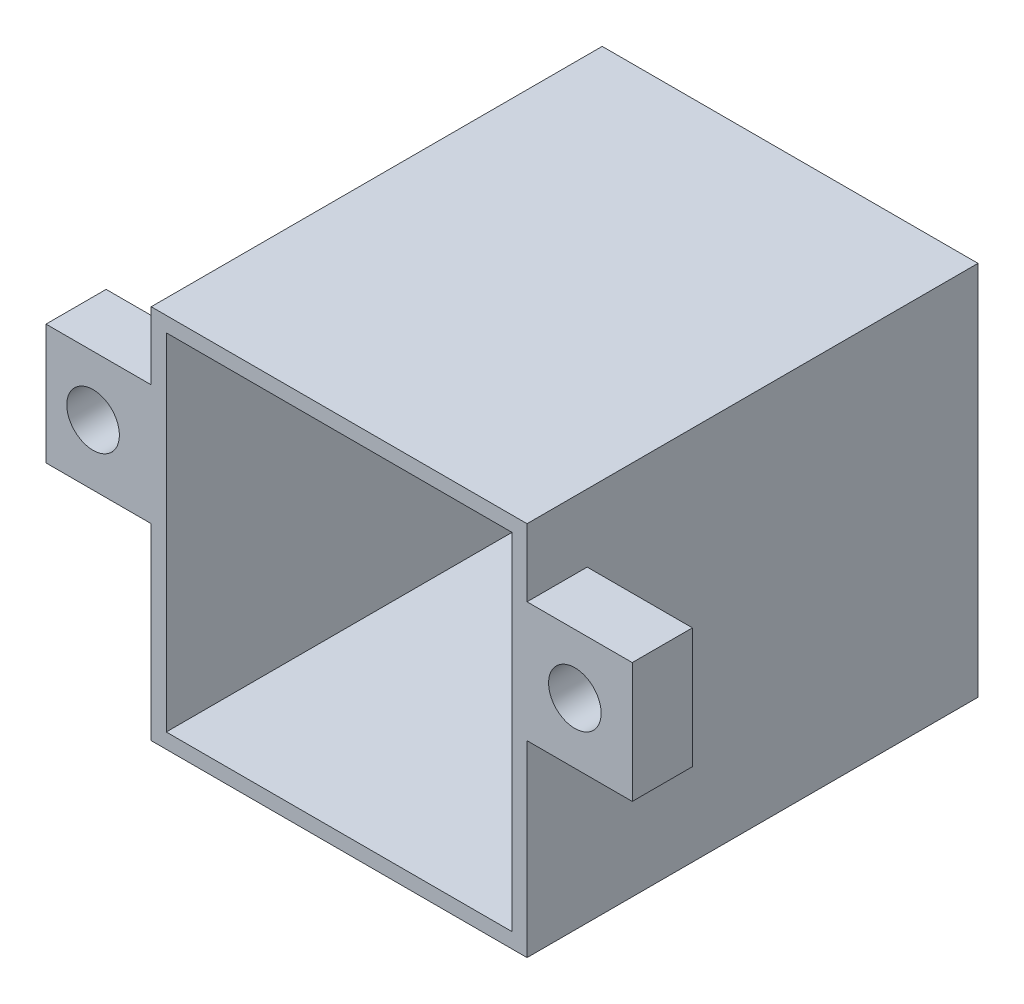
ISO-10303-21;
HEADER;
FILE_DESCRIPTION(('STEP AP214'),'2;1');
FILE_NAME('part.step','',(''),(''),'','','');
FILE_SCHEMA(('AUTOMOTIVE_DESIGN { 1 0 10303 214 1 1 1 1 }'));
ENDSEC;
DATA;
#1=APPLICATION_CONTEXT('core data for automotive mechanical design processes');
#2=APPLICATION_PROTOCOL_DEFINITION('international standard','automotive_design',2000,#1);
#3=PRODUCT_CONTEXT('',#1,'mechanical');
#4=PRODUCT('Part','Part','',(#3));
#5=PRODUCT_RELATED_PRODUCT_CATEGORY('part','',(#4));
#6=PRODUCT_DEFINITION_FORMATION('','',#4);
#7=PRODUCT_DEFINITION_CONTEXT('part definition',#1,'design');
#8=PRODUCT_DEFINITION('design','',#6,#7);
#9=PRODUCT_DEFINITION_SHAPE('','',#8);
#10=(LENGTH_UNIT() NAMED_UNIT(*) SI_UNIT(.MILLI.,.METRE.));
#11=(NAMED_UNIT(*) PLANE_ANGLE_UNIT() SI_UNIT($,.RADIAN.));
#12=(NAMED_UNIT(*) SI_UNIT($,.STERADIAN.) SOLID_ANGLE_UNIT());
#13=UNCERTAINTY_MEASURE_WITH_UNIT(LENGTH_MEASURE(1.E-05),#10,'distance_accuracy_value','');
#14=(GEOMETRIC_REPRESENTATION_CONTEXT(3) GLOBAL_UNCERTAINTY_ASSIGNED_CONTEXT((#13)) GLOBAL_UNIT_ASSIGNED_CONTEXT((#10,
#11,#12)) REPRESENTATION_CONTEXT('',''));
#15=CARTESIAN_POINT('',(0.,0.,0.));
#16=DIRECTION('',(0.,0.,1.));
#17=DIRECTION('',(1.,0.,0.));
#18=AXIS2_PLACEMENT_3D('',#15,#16,#17);
#19=CARTESIAN_POINT('',(-12.5,-12.5,30.));
#20=DIRECTION('',(1.,0.,0.));
#21=DIRECTION('',(0.,0.,-1.));
#22=AXIS2_PLACEMENT_3D('',#19,#20,#21);
#23=PLANE('',#22);
#24=DIRECTION('',(0.,0.,1.));
#25=VECTOR('',#24,1.);
#26=CARTESIAN_POINT('',(-12.5,0.,26.));
#27=LINE('',#26,#25);
#28=CARTESIAN_POINT('',(-12.5,0.,26.));
#29=VERTEX_POINT('',#28);
#30=CARTESIAN_POINT('',(-12.5,0.,30.));
#31=VERTEX_POINT('',#30);
#32=EDGE_CURVE('E177',#29,#31,#27,.T.);
#33=ORIENTED_EDGE('',*,*,#32,.F.);
#34=DIRECTION('',(0.,1.,0.));
#35=VECTOR('',#34,1.);
#36=CARTESIAN_POINT('',(-12.5,0.,26.));
#37=LINE('',#36,#35);
#38=CARTESIAN_POINT('',(-12.5,8.,26.));
#39=VERTEX_POINT('',#38);
#40=EDGE_CURVE('E169',#29,#39,#37,.T.);
#41=ORIENTED_EDGE('',*,*,#40,.T.);
#42=DIRECTION('',(0.,0.,1.));
#43=VECTOR('',#42,1.);
#44=CARTESIAN_POINT('',(-12.5,8.,26.));
#45=LINE('',#44,#43);
#46=CARTESIAN_POINT('',(-12.5,8.,30.));
#47=VERTEX_POINT('',#46);
#48=EDGE_CURVE('E153',#39,#47,#45,.T.);
#49=ORIENTED_EDGE('',*,*,#48,.T.);
#50=DIRECTION('',(0.,-1.,0.));
#51=VECTOR('',#50,1.);
#52=CARTESIAN_POINT('',(-12.5,-12.5,30.));
#53=LINE('',#52,#51);
#54=CARTESIAN_POINT('',(-12.5,12.5,30.));
#55=VERTEX_POINT('',#54);
#56=EDGE_CURVE('E300',#55,#47,#53,.T.);
#57=ORIENTED_EDGE('',*,*,#56,.F.);
#58=DIRECTION('',(0.,0.,-1.));
#59=VECTOR('',#58,1.);
#60=CARTESIAN_POINT('',(-12.5,12.5,30.));
#61=LINE('',#60,#59);
#62=CARTESIAN_POINT('',(-12.5,12.5,0.));
#63=VERTEX_POINT('',#62);
#64=EDGE_CURVE('E49',#55,#63,#61,.T.);
#65=ORIENTED_EDGE('',*,*,#64,.T.);
#66=DIRECTION('',(0.,-1.,0.));
#67=VECTOR('',#66,1.);
#68=CARTESIAN_POINT('',(-12.5,-12.5,0.));
#69=LINE('',#68,#67);
#70=CARTESIAN_POINT('',(-12.5,-12.5,0.));
#71=VERTEX_POINT('',#70);
#72=EDGE_CURVE('E313',#63,#71,#69,.T.);
#73=ORIENTED_EDGE('',*,*,#72,.T.);
#74=DIRECTION('',(0.,0.,-1.));
#75=VECTOR('',#74,1.);
#76=CARTESIAN_POINT('',(-12.5,-12.5,30.));
#77=LINE('',#76,#75);
#78=CARTESIAN_POINT('',(-12.5,-12.5,30.));
#79=VERTEX_POINT('',#78);
#80=EDGE_CURVE('E322',#79,#71,#77,.T.);
#81=ORIENTED_EDGE('',*,*,#80,.F.);
#82=EDGE_CURVE('E299',#31,#79,#53,.T.);
#83=ORIENTED_EDGE('',*,*,#82,.F.);
#84=EDGE_LOOP('',(#33,#41,#49,#57,#65,#73,#81,#83));
#85=FACE_BOUND('',#84,.T.);
#86=ADVANCED_FACE('F39',(#85),#23,.F.);
#87=CARTESIAN_POINT('',(12.5,-12.5,30.));
#88=DIRECTION('',(-1.,0.,0.));
#89=DIRECTION('',(0.,0.,1.));
#90=AXIS2_PLACEMENT_3D('',#87,#88,#89);
#91=PLANE('',#90);
#92=DIRECTION('',(0.,0.,1.));
#93=VECTOR('',#92,1.);
#94=CARTESIAN_POINT('',(12.5,8.,26.));
#95=LINE('',#94,#93);
#96=CARTESIAN_POINT('',(12.5,8.,26.));
#97=VERTEX_POINT('',#96);
#98=CARTESIAN_POINT('',(12.5,8.,30.));
#99=VERTEX_POINT('',#98);
#100=EDGE_CURVE('E232',#97,#99,#95,.T.);
#101=ORIENTED_EDGE('',*,*,#100,.F.);
#102=DIRECTION('',(0.,-1.,0.));
#103=VECTOR('',#102,1.);
#104=CARTESIAN_POINT('',(12.5,0.,26.));
#105=LINE('',#104,#103);
#106=CARTESIAN_POINT('',(12.5,0.,26.));
#107=VERTEX_POINT('',#106);
#108=EDGE_CURVE('E205',#97,#107,#105,.T.);
#109=ORIENTED_EDGE('',*,*,#108,.T.);
#110=DIRECTION('',(0.,0.,1.));
#111=VECTOR('',#110,1.);
#112=CARTESIAN_POINT('',(12.5,0.,26.));
#113=LINE('',#112,#111);
#114=CARTESIAN_POINT('',(12.5,0.,30.));
#115=VERTEX_POINT('',#114);
#116=EDGE_CURVE('E222',#107,#115,#113,.T.);
#117=ORIENTED_EDGE('',*,*,#116,.T.);
#118=DIRECTION('',(0.,1.,0.));
#119=VECTOR('',#118,1.);
#120=CARTESIAN_POINT('',(12.5,-12.5,30.));
#121=LINE('',#120,#119);
#122=CARTESIAN_POINT('',(12.5,-12.5,30.));
#123=VERTEX_POINT('',#122);
#124=EDGE_CURVE('E291',#123,#115,#121,.T.);
#125=ORIENTED_EDGE('',*,*,#124,.F.);
#126=DIRECTION('',(0.,0.,-1.));
#127=VECTOR('',#126,1.);
#128=CARTESIAN_POINT('',(12.5,-12.5,30.));
#129=LINE('',#128,#127);
#130=CARTESIAN_POINT('',(12.5,-12.5,0.));
#131=VERTEX_POINT('',#130);
#132=EDGE_CURVE('E306',#123,#131,#129,.T.);
#133=ORIENTED_EDGE('',*,*,#132,.T.);
#134=DIRECTION('',(0.,1.,0.));
#135=VECTOR('',#134,1.);
#136=CARTESIAN_POINT('',(12.5,-12.5,0.));
#137=LINE('',#136,#135);
#138=CARTESIAN_POINT('',(12.5,12.5,0.));
#139=VERTEX_POINT('',#138);
#140=EDGE_CURVE('E257',#131,#139,#137,.T.);
#141=ORIENTED_EDGE('',*,*,#140,.T.);
#142=DIRECTION('',(0.,0.,-1.));
#143=VECTOR('',#142,1.);
#144=CARTESIAN_POINT('',(12.5,12.5,30.));
#145=LINE('',#144,#143);
#146=CARTESIAN_POINT('',(12.5,12.5,30.));
#147=VERTEX_POINT('',#146);
#148=EDGE_CURVE('E11',#147,#139,#145,.T.);
#149=ORIENTED_EDGE('',*,*,#148,.F.);
#150=EDGE_CURVE('E296',#99,#147,#121,.T.);
#151=ORIENTED_EDGE('',*,*,#150,.F.);
#152=EDGE_LOOP('',(#101,#109,#117,#125,#133,#141,#149,#151));
#153=FACE_BOUND('',#152,.T.);
#154=ADVANCED_FACE('F41',(#153),#91,.F.);
#155=CARTESIAN_POINT('',(0.,0.,30.));
#156=DIRECTION('',(0.,0.,-1.));
#157=DIRECTION('',(-1.,0.,0.));
#158=AXIS2_PLACEMENT_3D('',#155,#156,#157);
#159=PLANE('',#158);
#160=CARTESIAN_POINT('',(15.6821223873385,4.04326438651824,30.));
#161=DIRECTION('',(0.,0.,1.));
#162=DIRECTION('',(1.,0.,0.));
#163=AXIS2_PLACEMENT_3D('',#160,#161,#162);
#164=CIRCLE('',#163,1.75);
#165=CARTESIAN_POINT('',(17.4321223873385,4.04326438651824,30.));
#166=VERTEX_POINT('',#165);
#167=EDGE_CURVE('E334',#166,#166,#164,.T.);
#168=ORIENTED_EDGE('',*,*,#167,.F.);
#169=EDGE_LOOP('',(#168));
#170=FACE_BOUND('',#169,.T.);
#171=CARTESIAN_POINT('',(-16.3676277759518,4.04326438651824,30.));
#172=DIRECTION('',(0.,0.,1.));
#173=DIRECTION('',(1.,0.,0.));
#174=AXIS2_PLACEMENT_3D('',#171,#172,#173);
#175=CIRCLE('',#174,1.75);
#176=CARTESIAN_POINT('',(-14.6176277759518,4.04326438651824,30.));
#177=VERTEX_POINT('',#176);
#178=EDGE_CURVE('E186',#177,#177,#175,.T.);
#179=ORIENTED_EDGE('',*,*,#178,.F.);
#180=EDGE_LOOP('',(#179));
#181=FACE_BOUND('',#180,.T.);
#182=ORIENTED_EDGE('',*,*,#124,.T.);
#183=DIRECTION('',(1.,0.,0.));
#184=VECTOR('',#183,1.);
#185=CARTESIAN_POINT('',(12.5,0.,30.));
#186=LINE('',#185,#184);
#187=CARTESIAN_POINT('',(19.5,0.,30.));
#188=VERTEX_POINT('',#187);
#189=EDGE_CURVE('E65',#115,#188,#186,.T.);
#190=ORIENTED_EDGE('',*,*,#189,.T.);
#191=DIRECTION('',(0.,1.,0.));
#192=VECTOR('',#191,1.);
#193=CARTESIAN_POINT('',(19.5,0.,30.));
#194=LINE('',#193,#192);
#195=CARTESIAN_POINT('',(19.5,8.,30.));
#196=VERTEX_POINT('',#195);
#197=EDGE_CURVE('E225',#188,#196,#194,.T.);
#198=ORIENTED_EDGE('',*,*,#197,.T.);
#199=DIRECTION('',(-1.,0.,0.));
#200=VECTOR('',#199,1.);
#201=CARTESIAN_POINT('',(12.5,8.,30.));
#202=LINE('',#201,#200);
#203=EDGE_CURVE('E210',#196,#99,#202,.T.);
#204=ORIENTED_EDGE('',*,*,#203,.T.);
#205=ORIENTED_EDGE('',*,*,#150,.T.);
#206=DIRECTION('',(-1.,0.,0.));
#207=VECTOR('',#206,1.);
#208=CARTESIAN_POINT('',(-12.5,12.5,30.));
#209=LINE('',#208,#207);
#210=EDGE_CURVE('E295',#147,#55,#209,.T.);
#211=ORIENTED_EDGE('',*,*,#210,.T.);
#212=ORIENTED_EDGE('',*,*,#56,.T.);
#213=DIRECTION('',(-1.,0.,0.));
#214=VECTOR('',#213,1.);
#215=CARTESIAN_POINT('',(-12.5,8.,30.));
#216=LINE('',#215,#214);
#217=CARTESIAN_POINT('',(-19.5,8.,30.));
#218=VERTEX_POINT('',#217);
#219=EDGE_CURVE('E57',#47,#218,#216,.T.);
#220=ORIENTED_EDGE('',*,*,#219,.T.);
#221=DIRECTION('',(0.,-1.,0.));
#222=VECTOR('',#221,1.);
#223=CARTESIAN_POINT('',(-19.5,0.,30.));
#224=LINE('',#223,#222);
#225=CARTESIAN_POINT('',(-19.5,0.,30.));
#226=VERTEX_POINT('',#225);
#227=EDGE_CURVE('E183',#218,#226,#224,.T.);
#228=ORIENTED_EDGE('',*,*,#227,.T.);
#229=DIRECTION('',(1.,0.,0.));
#230=VECTOR('',#229,1.);
#231=CARTESIAN_POINT('',(-12.5,0.,30.));
#232=LINE('',#231,#230);
#233=EDGE_CURVE('E179',#226,#31,#232,.T.);
#234=ORIENTED_EDGE('',*,*,#233,.T.);
#235=ORIENTED_EDGE('',*,*,#82,.T.);
#236=DIRECTION('',(1.,0.,0.));
#237=VECTOR('',#236,1.);
#238=CARTESIAN_POINT('',(-12.5,-12.5,30.));
#239=LINE('',#238,#237);
#240=EDGE_CURVE('E303',#79,#123,#239,.T.);
#241=ORIENTED_EDGE('',*,*,#240,.T.);
#242=EDGE_LOOP('',(#182,#190,#198,#204,#205,#211,#212,#220,#228,#234,#235,#241));
#243=FACE_BOUND('',#242,.T.);
#244=DIRECTION('',(0.,1.,0.));
#245=VECTOR('',#244,1.);
#246=CARTESIAN_POINT('',(11.5,0.,30.));
#247=LINE('',#246,#245);
#248=CARTESIAN_POINT('',(11.5,-11.5,30.));
#249=VERTEX_POINT('',#248);
#250=CARTESIAN_POINT('',(11.5,11.5,30.));
#251=VERTEX_POINT('',#250);
#252=EDGE_CURVE('E279',#249,#251,#247,.T.);
#253=ORIENTED_EDGE('',*,*,#252,.F.);
#254=DIRECTION('',(1.,0.,0.));
#255=VECTOR('',#254,1.);
#256=CARTESIAN_POINT('',(0.,-11.5,30.));
#257=LINE('',#256,#255);
#258=CARTESIAN_POINT('',(-11.5,-11.5,30.));
#259=VERTEX_POINT('',#258);
#260=EDGE_CURVE('E264',#259,#249,#257,.T.);
#261=ORIENTED_EDGE('',*,*,#260,.F.);
#262=DIRECTION('',(0.,-1.,0.));
#263=VECTOR('',#262,1.);
#264=CARTESIAN_POINT('',(-11.5,0.,30.));
#265=LINE('',#264,#263);
#266=CARTESIAN_POINT('',(-11.5,11.5,30.));
#267=VERTEX_POINT('',#266);
#268=EDGE_CURVE('E285',#267,#259,#265,.T.);
#269=ORIENTED_EDGE('',*,*,#268,.F.);
#270=DIRECTION('',(-1.,0.,0.));
#271=VECTOR('',#270,1.);
#272=CARTESIAN_POINT('',(0.,11.5,30.));
#273=LINE('',#272,#271);
#274=EDGE_CURVE('E282',#251,#267,#273,.T.);
#275=ORIENTED_EDGE('',*,*,#274,.F.);
#276=EDGE_LOOP('',(#253,#261,#269,#275));
#277=FACE_BOUND('',#276,.T.);
#278=ADVANCED_FACE('F350',(#170,#181,#243,#277),#159,.F.);
#279=CARTESIAN_POINT('',(-12.5,12.5,30.));
#280=DIRECTION('',(0.,-1.,0.));
#281=DIRECTION('',(0.,0.,-1.));
#282=AXIS2_PLACEMENT_3D('',#279,#280,#281);
#283=PLANE('',#282);
#284=DIRECTION('',(-1.,0.,0.));
#285=VECTOR('',#284,1.);
#286=CARTESIAN_POINT('',(-12.5,12.5,0.));
#287=LINE('',#286,#285);
#288=EDGE_CURVE('E310',#139,#63,#287,.T.);
#289=ORIENTED_EDGE('',*,*,#288,.T.);
#290=ORIENTED_EDGE('',*,*,#64,.F.);
#291=ORIENTED_EDGE('',*,*,#210,.F.);
#292=ORIENTED_EDGE('',*,*,#148,.T.);
#293=EDGE_LOOP('',(#289,#290,#291,#292));
#294=FACE_BOUND('',#293,.T.);
#295=ADVANCED_FACE('F353',(#294),#283,.F.);
#296=CARTESIAN_POINT('',(-12.5,-12.5,30.));
#297=DIRECTION('',(0.,1.,0.));
#298=DIRECTION('',(0.,0.,1.));
#299=AXIS2_PLACEMENT_3D('',#296,#297,#298);
#300=PLANE('',#299);
#301=DIRECTION('',(1.,0.,0.));
#302=VECTOR('',#301,1.);
#303=CARTESIAN_POINT('',(-12.5,-12.5,0.));
#304=LINE('',#303,#302);
#305=EDGE_CURVE('E316',#71,#131,#304,.T.);
#306=ORIENTED_EDGE('',*,*,#305,.T.);
#307=ORIENTED_EDGE('',*,*,#132,.F.);
#308=ORIENTED_EDGE('',*,*,#240,.F.);
#309=ORIENTED_EDGE('',*,*,#80,.T.);
#310=EDGE_LOOP('',(#306,#307,#308,#309));
#311=FACE_BOUND('',#310,.T.);
#312=ADVANCED_FACE('F393',(#311),#300,.F.);
#313=CARTESIAN_POINT('',(0.,0.,0.));
#314=DIRECTION('',(0.,0.,-1.));
#315=DIRECTION('',(-1.,0.,0.));
#316=AXIS2_PLACEMENT_3D('',#313,#314,#315);
#317=PLANE('',#316);
#318=CARTESIAN_POINT('',(0.,0.,0.));
#319=DIRECTION('',(0.,0.,-1.));
#320=DIRECTION('',(-1.,0.,0.));
#321=AXIS2_PLACEMENT_3D('',#318,#319,#320);
#322=CIRCLE('',#321,5.25);
#323=CARTESIAN_POINT('',(-5.25,0.,0.));
#324=VERTEX_POINT('',#323);
#325=EDGE_CURVE('E235',#324,#324,#322,.T.);
#326=ORIENTED_EDGE('',*,*,#325,.F.);
#327=EDGE_LOOP('',(#326));
#328=FACE_BOUND('',#327,.T.);
#329=ORIENTED_EDGE('',*,*,#140,.F.);
#330=ORIENTED_EDGE('',*,*,#305,.F.);
#331=ORIENTED_EDGE('',*,*,#72,.F.);
#332=ORIENTED_EDGE('',*,*,#288,.F.);
#333=EDGE_LOOP('',(#329,#330,#331,#332));
#334=FACE_BOUND('',#333,.T.);
#335=ADVANCED_FACE('F400',(#328,#334),#317,.T.);
#336=CARTESIAN_POINT('',(11.5,-12.5,30.));
#337=DIRECTION('',(-1.,0.,0.));
#338=DIRECTION('',(0.,0.,1.));
#339=AXIS2_PLACEMENT_3D('',#336,#337,#338);
#340=PLANE('',#339);
#341=DIRECTION('',(0.,1.,0.));
#342=VECTOR('',#341,1.);
#343=CARTESIAN_POINT('',(11.5,0.,1.));
#344=LINE('',#343,#342);
#345=CARTESIAN_POINT('',(11.5,-11.5,1.));
#346=VERTEX_POINT('',#345);
#347=CARTESIAN_POINT('',(11.5,11.5,1.));
#348=VERTEX_POINT('',#347);
#349=EDGE_CURVE('E248',#346,#348,#344,.T.);
#350=ORIENTED_EDGE('',*,*,#349,.F.);
#351=DIRECTION('',(0.,0.,-1.));
#352=VECTOR('',#351,1.);
#353=CARTESIAN_POINT('',(11.5,-11.5,30.));
#354=LINE('',#353,#352);
#355=EDGE_CURVE('E259',#249,#346,#354,.T.);
#356=ORIENTED_EDGE('',*,*,#355,.F.);
#357=ORIENTED_EDGE('',*,*,#252,.T.);
#358=DIRECTION('',(0.,0.,-1.));
#359=VECTOR('',#358,1.);
#360=CARTESIAN_POINT('',(11.5,11.5,30.));
#361=LINE('',#360,#359);
#362=EDGE_CURVE('E253',#251,#348,#361,.T.);
#363=ORIENTED_EDGE('',*,*,#362,.T.);
#364=EDGE_LOOP('',(#350,#356,#357,#363));
#365=FACE_BOUND('',#364,.T.);
#366=ADVANCED_FACE('F366',(#365),#340,.T.);
#367=CARTESIAN_POINT('',(-12.5,11.5,30.));
#368=DIRECTION('',(0.,-1.,0.));
#369=DIRECTION('',(0.,0.,-1.));
#370=AXIS2_PLACEMENT_3D('',#367,#368,#369);
#371=PLANE('',#370);
#372=DIRECTION('',(-1.,0.,0.));
#373=VECTOR('',#372,1.);
#374=CARTESIAN_POINT('',(0.,11.5,1.));
#375=LINE('',#374,#373);
#376=CARTESIAN_POINT('',(-11.5,11.5,1.));
#377=VERTEX_POINT('',#376);
#378=EDGE_CURVE('E252',#348,#377,#375,.T.);
#379=ORIENTED_EDGE('',*,*,#378,.F.);
#380=ORIENTED_EDGE('',*,*,#362,.F.);
#381=ORIENTED_EDGE('',*,*,#274,.T.);
#382=DIRECTION('',(0.,0.,-1.));
#383=VECTOR('',#382,1.);
#384=CARTESIAN_POINT('',(-11.5,11.5,30.));
#385=LINE('',#384,#383);
#386=EDGE_CURVE('E258',#267,#377,#385,.T.);
#387=ORIENTED_EDGE('',*,*,#386,.T.);
#388=EDGE_LOOP('',(#379,#380,#381,#387));
#389=FACE_BOUND('',#388,.T.);
#390=ADVANCED_FACE('F368',(#389),#371,.T.);
#391=CARTESIAN_POINT('',(-11.5,-12.5,30.));
#392=DIRECTION('',(1.,0.,0.));
#393=DIRECTION('',(0.,0.,-1.));
#394=AXIS2_PLACEMENT_3D('',#391,#392,#393);
#395=PLANE('',#394);
#396=DIRECTION('',(0.,-1.,0.));
#397=VECTOR('',#396,1.);
#398=CARTESIAN_POINT('',(-11.5,0.,1.));
#399=LINE('',#398,#397);
#400=CARTESIAN_POINT('',(-11.5,-11.5,1.));
#401=VERTEX_POINT('',#400);
#402=EDGE_CURVE('E267',#377,#401,#399,.T.);
#403=ORIENTED_EDGE('',*,*,#402,.F.);
#404=ORIENTED_EDGE('',*,*,#386,.F.);
#405=ORIENTED_EDGE('',*,*,#268,.T.);
#406=DIRECTION('',(0.,0.,-1.));
#407=VECTOR('',#406,1.);
#408=CARTESIAN_POINT('',(-11.5,-11.5,30.));
#409=LINE('',#408,#407);
#410=EDGE_CURVE('E263',#259,#401,#409,.T.);
#411=ORIENTED_EDGE('',*,*,#410,.T.);
#412=EDGE_LOOP('',(#403,#404,#405,#411));
#413=FACE_BOUND('',#412,.T.);
#414=ADVANCED_FACE('F377',(#413),#395,.T.);
#415=CARTESIAN_POINT('',(-12.5,-11.5,30.));
#416=DIRECTION('',(0.,1.,0.));
#417=DIRECTION('',(0.,0.,1.));
#418=AXIS2_PLACEMENT_3D('',#415,#416,#417);
#419=PLANE('',#418);
#420=DIRECTION('',(1.,0.,0.));
#421=VECTOR('',#420,1.);
#422=CARTESIAN_POINT('',(0.,-11.5,1.));
#423=LINE('',#422,#421);
#424=EDGE_CURVE('E273',#401,#346,#423,.T.);
#425=ORIENTED_EDGE('',*,*,#424,.F.);
#426=ORIENTED_EDGE('',*,*,#410,.F.);
#427=ORIENTED_EDGE('',*,*,#260,.T.);
#428=ORIENTED_EDGE('',*,*,#355,.T.);
#429=EDGE_LOOP('',(#425,#426,#427,#428));
#430=FACE_BOUND('',#429,.T.);
#431=ADVANCED_FACE('F375',(#430),#419,.T.);
#432=CARTESIAN_POINT('',(0.,0.,1.));
#433=DIRECTION('',(0.,0.,-1.));
#434=DIRECTION('',(-1.,0.,0.));
#435=AXIS2_PLACEMENT_3D('',#432,#433,#434);
#436=PLANE('',#435);
#437=CARTESIAN_POINT('',(0.,0.,1.));
#438=DIRECTION('',(0.,0.,-1.));
#439=DIRECTION('',(-1.,0.,0.));
#440=AXIS2_PLACEMENT_3D('',#437,#438,#439);
#441=CIRCLE('',#440,5.25);
#442=CARTESIAN_POINT('',(-5.25,0.,1.));
#443=VERTEX_POINT('',#442);
#444=EDGE_CURVE('E247',#443,#443,#441,.T.);
#445=ORIENTED_EDGE('',*,*,#444,.T.);
#446=EDGE_LOOP('',(#445));
#447=FACE_BOUND('',#446,.T.);
#448=ORIENTED_EDGE('',*,*,#349,.T.);
#449=ORIENTED_EDGE('',*,*,#378,.T.);
#450=ORIENTED_EDGE('',*,*,#402,.T.);
#451=ORIENTED_EDGE('',*,*,#424,.T.);
#452=EDGE_LOOP('',(#448,#449,#450,#451));
#453=FACE_BOUND('',#452,.T.);
#454=ADVANCED_FACE('F372',(#447,#453),#436,.F.);
#455=CARTESIAN_POINT('',(0.,0.,25.));
#456=DIRECTION('',(0.,0.,-1.));
#457=DIRECTION('',(-1.,0.,0.));
#458=AXIS2_PLACEMENT_3D('',#455,#456,#457);
#459=CYLINDRICAL_SURFACE('',#458,5.25);
#460=ORIENTED_EDGE('',*,*,#325,.T.);
#461=EDGE_LOOP('',(#460));
#462=FACE_BOUND('',#461,.T.);
#463=ORIENTED_EDGE('',*,*,#444,.F.);
#464=EDGE_LOOP('',(#463));
#465=FACE_BOUND('',#464,.T.);
#466=ADVANCED_FACE('F449',(#462,#465),#459,.F.);
#467=CARTESIAN_POINT('',(12.5,8.,26.));
#468=DIRECTION('',(0.,1.,0.));
#469=DIRECTION('',(0.,0.,1.));
#470=AXIS2_PLACEMENT_3D('',#467,#468,#469);
#471=PLANE('',#470);
#472=ORIENTED_EDGE('',*,*,#203,.F.);
#473=DIRECTION('',(0.,0.,1.));
#474=VECTOR('',#473,1.);
#475=CARTESIAN_POINT('',(19.5,8.,26.));
#476=LINE('',#475,#474);
#477=CARTESIAN_POINT('',(19.5,8.,26.));
#478=VERTEX_POINT('',#477);
#479=EDGE_CURVE('E236',#478,#196,#476,.T.);
#480=ORIENTED_EDGE('',*,*,#479,.F.);
#481=DIRECTION('',(-1.,0.,0.));
#482=VECTOR('',#481,1.);
#483=CARTESIAN_POINT('',(12.5,8.,26.));
#484=LINE('',#483,#482);
#485=EDGE_CURVE('E218',#478,#97,#484,.T.);
#486=ORIENTED_EDGE('',*,*,#485,.T.);
#487=ORIENTED_EDGE('',*,*,#100,.T.);
#488=EDGE_LOOP('',(#472,#480,#486,#487));
#489=FACE_BOUND('',#488,.T.);
#490=ADVANCED_FACE('F425',(#489),#471,.T.);
#491=CARTESIAN_POINT('',(19.5,0.,26.));
#492=DIRECTION('',(1.,0.,0.));
#493=DIRECTION('',(0.,0.,-1.));
#494=AXIS2_PLACEMENT_3D('',#491,#492,#493);
#495=PLANE('',#494);
#496=ORIENTED_EDGE('',*,*,#197,.F.);
#497=DIRECTION('',(0.,0.,1.));
#498=VECTOR('',#497,1.);
#499=CARTESIAN_POINT('',(19.5,0.,26.));
#500=LINE('',#499,#498);
#501=CARTESIAN_POINT('',(19.5,0.,26.));
#502=VERTEX_POINT('',#501);
#503=EDGE_CURVE('E239',#502,#188,#500,.T.);
#504=ORIENTED_EDGE('',*,*,#503,.F.);
#505=DIRECTION('',(0.,1.,0.));
#506=VECTOR('',#505,1.);
#507=CARTESIAN_POINT('',(19.5,0.,26.));
#508=LINE('',#507,#506);
#509=EDGE_CURVE('E214',#502,#478,#508,.T.);
#510=ORIENTED_EDGE('',*,*,#509,.T.);
#511=ORIENTED_EDGE('',*,*,#479,.T.);
#512=EDGE_LOOP('',(#496,#504,#510,#511));
#513=FACE_BOUND('',#512,.T.);
#514=ADVANCED_FACE('F421',(#513),#495,.T.);
#515=CARTESIAN_POINT('',(12.5,0.,26.));
#516=DIRECTION('',(0.,-1.,0.));
#517=DIRECTION('',(0.,0.,-1.));
#518=AXIS2_PLACEMENT_3D('',#515,#516,#517);
#519=PLANE('',#518);
#520=ORIENTED_EDGE('',*,*,#189,.F.);
#521=ORIENTED_EDGE('',*,*,#116,.F.);
#522=DIRECTION('',(1.,0.,0.));
#523=VECTOR('',#522,1.);
#524=CARTESIAN_POINT('',(12.5,0.,26.));
#525=LINE('',#524,#523);
#526=EDGE_CURVE('E209',#107,#502,#525,.T.);
#527=ORIENTED_EDGE('',*,*,#526,.T.);
#528=ORIENTED_EDGE('',*,*,#503,.T.);
#529=EDGE_LOOP('',(#520,#521,#527,#528));
#530=FACE_BOUND('',#529,.T.);
#531=ADVANCED_FACE('F414',(#530),#519,.T.);
#532=CARTESIAN_POINT('',(0.,0.,26.));
#533=DIRECTION('',(0.,0.,-1.));
#534=DIRECTION('',(-1.,0.,0.));
#535=AXIS2_PLACEMENT_3D('',#532,#533,#534);
#536=PLANE('',#535);
#537=CARTESIAN_POINT('',(15.6821223873385,4.04326438651824,26.));
#538=DIRECTION('',(0.,0.,-1.));
#539=DIRECTION('',(-1.,0.,0.));
#540=AXIS2_PLACEMENT_3D('',#537,#538,#539);
#541=CIRCLE('',#540,1.75);
#542=CARTESIAN_POINT('',(13.9321223873385,4.04326438651824,26.));
#543=VERTEX_POINT('',#542);
#544=EDGE_CURVE('E43',#543,#543,#541,.T.);
#545=ORIENTED_EDGE('',*,*,#544,.F.);
#546=EDGE_LOOP('',(#545));
#547=FACE_BOUND('',#546,.T.);
#548=ORIENTED_EDGE('',*,*,#108,.F.);
#549=ORIENTED_EDGE('',*,*,#485,.F.);
#550=ORIENTED_EDGE('',*,*,#509,.F.);
#551=ORIENTED_EDGE('',*,*,#526,.F.);
#552=EDGE_LOOP('',(#548,#549,#550,#551));
#553=FACE_BOUND('',#552,.T.);
#554=ADVANCED_FACE('F417',(#547,#553),#536,.T.);
#555=CARTESIAN_POINT('',(-12.5,0.,26.));
#556=DIRECTION('',(0.,-1.,0.));
#557=DIRECTION('',(1.,0.,0.));
#558=AXIS2_PLACEMENT_3D('',#555,#556,#557);
#559=PLANE('',#558);
#560=ORIENTED_EDGE('',*,*,#233,.F.);
#561=DIRECTION('',(0.,0.,1.));
#562=VECTOR('',#561,1.);
#563=CARTESIAN_POINT('',(-19.5,0.,26.));
#564=LINE('',#563,#562);
#565=CARTESIAN_POINT('',(-19.5,0.,26.));
#566=VERTEX_POINT('',#565);
#567=EDGE_CURVE('E200',#566,#226,#564,.T.);
#568=ORIENTED_EDGE('',*,*,#567,.F.);
#569=DIRECTION('',(1.,0.,0.));
#570=VECTOR('',#569,1.);
#571=CARTESIAN_POINT('',(-12.5,0.,26.));
#572=LINE('',#571,#570);
#573=EDGE_CURVE('E163',#566,#29,#572,.T.);
#574=ORIENTED_EDGE('',*,*,#573,.T.);
#575=ORIENTED_EDGE('',*,*,#32,.T.);
#576=EDGE_LOOP('',(#560,#568,#574,#575));
#577=FACE_BOUND('',#576,.T.);
#578=ADVANCED_FACE('F431',(#577),#559,.T.);
#579=CARTESIAN_POINT('',(-19.5,0.,26.));
#580=DIRECTION('',(-1.,0.,0.));
#581=DIRECTION('',(0.,-1.,0.));
#582=AXIS2_PLACEMENT_3D('',#579,#580,#581);
#583=PLANE('',#582);
#584=ORIENTED_EDGE('',*,*,#227,.F.);
#585=DIRECTION('',(0.,0.,1.));
#586=VECTOR('',#585,1.);
#587=CARTESIAN_POINT('',(-19.5,8.,26.));
#588=LINE('',#587,#586);
#589=CARTESIAN_POINT('',(-19.5,8.,26.));
#590=VERTEX_POINT('',#589);
#591=EDGE_CURVE('E162',#590,#218,#588,.T.);
#592=ORIENTED_EDGE('',*,*,#591,.F.);
#593=DIRECTION('',(0.,-1.,0.));
#594=VECTOR('',#593,1.);
#595=CARTESIAN_POINT('',(-19.5,0.,26.));
#596=LINE('',#595,#594);
#597=EDGE_CURVE('E172',#590,#566,#596,.T.);
#598=ORIENTED_EDGE('',*,*,#597,.T.);
#599=ORIENTED_EDGE('',*,*,#567,.T.);
#600=EDGE_LOOP('',(#584,#592,#598,#599));
#601=FACE_BOUND('',#600,.T.);
#602=ADVANCED_FACE('F433',(#601),#583,.T.);
#603=CARTESIAN_POINT('',(-12.5,8.,26.));
#604=DIRECTION('',(0.,1.,0.));
#605=DIRECTION('',(0.,0.,1.));
#606=AXIS2_PLACEMENT_3D('',#603,#604,#605);
#607=PLANE('',#606);
#608=ORIENTED_EDGE('',*,*,#219,.F.);
#609=ORIENTED_EDGE('',*,*,#48,.F.);
#610=DIRECTION('',(-1.,0.,0.));
#611=VECTOR('',#610,1.);
#612=CARTESIAN_POINT('',(-12.5,8.,26.));
#613=LINE('',#612,#611);
#614=EDGE_CURVE('E156',#39,#590,#613,.T.);
#615=ORIENTED_EDGE('',*,*,#614,.T.);
#616=ORIENTED_EDGE('',*,*,#591,.T.);
#617=EDGE_LOOP('',(#608,#609,#615,#616));
#618=FACE_BOUND('',#617,.T.);
#619=ADVANCED_FACE('F155',(#618),#607,.T.);
#620=CARTESIAN_POINT('',(0.,0.,26.));
#621=DIRECTION('',(0.,0.,1.));
#622=DIRECTION('',(1.,0.,0.));
#623=AXIS2_PLACEMENT_3D('',#620,#621,#622);
#624=PLANE('',#623);
#625=CARTESIAN_POINT('',(-16.3676277759518,4.04326438651824,26.));
#626=DIRECTION('',(0.,0.,1.));
#627=DIRECTION('',(1.,0.,0.));
#628=AXIS2_PLACEMENT_3D('',#625,#626,#627);
#629=CIRCLE('',#628,1.75);
#630=CARTESIAN_POINT('',(-14.6176277759518,4.04326438651824,26.));
#631=VERTEX_POINT('',#630);
#632=EDGE_CURVE('E331',#631,#631,#629,.T.);
#633=ORIENTED_EDGE('',*,*,#632,.T.);
#634=EDGE_LOOP('',(#633));
#635=FACE_BOUND('',#634,.T.);
#636=ORIENTED_EDGE('',*,*,#40,.F.);
#637=ORIENTED_EDGE('',*,*,#573,.F.);
#638=ORIENTED_EDGE('',*,*,#597,.F.);
#639=ORIENTED_EDGE('',*,*,#614,.F.);
#640=EDGE_LOOP('',(#636,#637,#638,#639));
#641=FACE_BOUND('',#640,.T.);
#642=ADVANCED_FACE('F167',(#635,#641),#624,.F.);
#643=CARTESIAN_POINT('',(-16.3676277759518,4.04326438651824,20.));
#644=DIRECTION('',(0.,0.,1.));
#645=DIRECTION('',(1.,0.,0.));
#646=AXIS2_PLACEMENT_3D('',#643,#644,#645);
#647=CYLINDRICAL_SURFACE('',#646,1.75);
#648=ORIENTED_EDGE('',*,*,#178,.T.);
#649=EDGE_LOOP('',(#648));
#650=FACE_BOUND('',#649,.T.);
#651=ORIENTED_EDGE('',*,*,#632,.F.);
#652=EDGE_LOOP('',(#651));
#653=FACE_BOUND('',#652,.T.);
#654=ADVANCED_FACE('F347',(#650,#653),#647,.F.);
#655=CARTESIAN_POINT('',(15.6821223873385,4.04326438651824,20.));
#656=DIRECTION('',(0.,0.,1.));
#657=DIRECTION('',(1.,0.,0.));
#658=AXIS2_PLACEMENT_3D('',#655,#656,#657);
#659=CYLINDRICAL_SURFACE('',#658,1.75);
#660=ORIENTED_EDGE('',*,*,#544,.T.);
#661=EDGE_LOOP('',(#660));
#662=FACE_BOUND('',#661,.T.);
#663=ORIENTED_EDGE('',*,*,#167,.T.);
#664=EDGE_LOOP('',(#663));
#665=FACE_BOUND('',#664,.T.);
#666=ADVANCED_FACE('F587',(#662,#665),#659,.F.);
#667=CLOSED_SHELL('',(#86,#154,#278,#295,#312,#335,#366,#390,#414,#431,#454,#466,#490,#514,#531,
#554,#578,#602,#619,#642,#654,#666));
#668=MANIFOLD_SOLID_BREP('B2',#667);
#669=ADVANCED_BREP_SHAPE_REPRESENTATION('',(#18,#668),#14);
#670=SHAPE_DEFINITION_REPRESENTATION(#9,#669);
ENDSEC;
END-ISO-10303-21;
